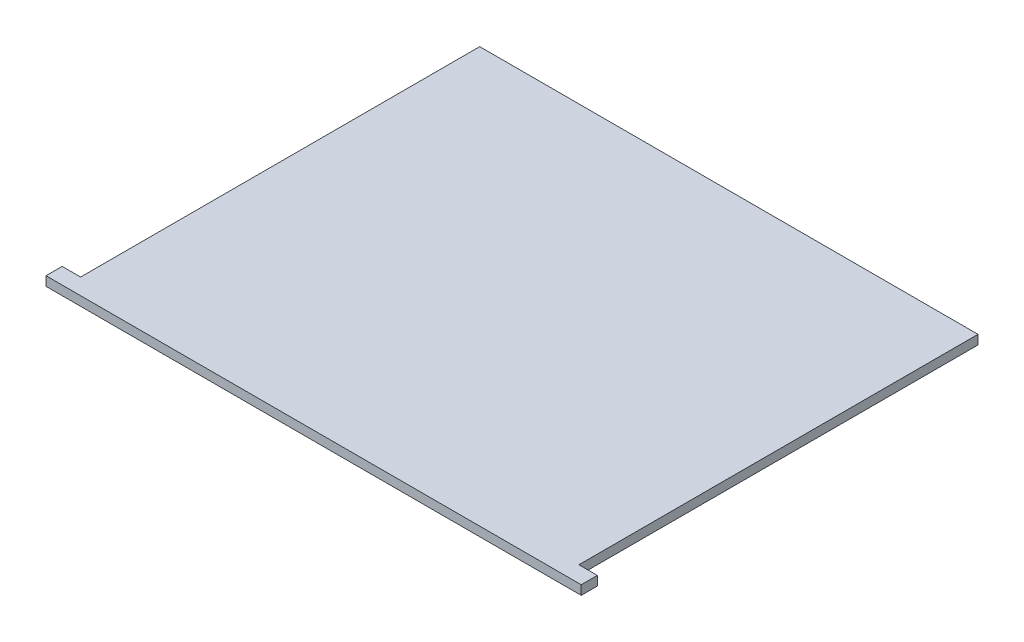
ISO-10303-21;
HEADER;
FILE_DESCRIPTION(('STEP AP214'),'2;1');
FILE_NAME('part.step','',(''),(''),'','','');
FILE_SCHEMA(('AUTOMOTIVE_DESIGN { 1 0 10303 214 1 1 1 1 }'));
ENDSEC;
DATA;
#1=APPLICATION_CONTEXT('core data for automotive mechanical design processes');
#2=APPLICATION_PROTOCOL_DEFINITION('international standard','automotive_design',2000,#1);
#3=PRODUCT_CONTEXT('',#1,'mechanical');
#4=PRODUCT('Part','Part','',(#3));
#5=PRODUCT_RELATED_PRODUCT_CATEGORY('part','',(#4));
#6=PRODUCT_DEFINITION_FORMATION('','',#4);
#7=PRODUCT_DEFINITION_CONTEXT('part definition',#1,'design');
#8=PRODUCT_DEFINITION('design','',#6,#7);
#9=PRODUCT_DEFINITION_SHAPE('','',#8);
#10=(LENGTH_UNIT() NAMED_UNIT(*) SI_UNIT(.MILLI.,.METRE.));
#11=(NAMED_UNIT(*) PLANE_ANGLE_UNIT() SI_UNIT($,.RADIAN.));
#12=(NAMED_UNIT(*) SI_UNIT($,.STERADIAN.) SOLID_ANGLE_UNIT());
#13=UNCERTAINTY_MEASURE_WITH_UNIT(LENGTH_MEASURE(1.E-05),#10,'distance_accuracy_value','');
#14=(GEOMETRIC_REPRESENTATION_CONTEXT(3) GLOBAL_UNCERTAINTY_ASSIGNED_CONTEXT((#13)) GLOBAL_UNIT_ASSIGNED_CONTEXT((#10,
#11,#12)) REPRESENTATION_CONTEXT('',''));
#15=CARTESIAN_POINT('',(0.,0.,0.));
#16=DIRECTION('',(0.,0.,1.));
#17=DIRECTION('',(1.,0.,0.));
#18=AXIS2_PLACEMENT_3D('',#15,#16,#17);
#19=CARTESIAN_POINT('',(27.,1.,-22.5));
#20=DIRECTION('',(-1.,0.,0.));
#21=DIRECTION('',(0.,0.,1.));
#22=AXIS2_PLACEMENT_3D('',#19,#20,#21);
#23=PLANE('',#22);
#24=DIRECTION('',(0.,0.,-1.));
#25=VECTOR('',#24,1.);
#26=CARTESIAN_POINT('',(27.,0.,-22.5));
#27=LINE('',#26,#25);
#28=CARTESIAN_POINT('',(27.,0.,20.75));
#29=VERTEX_POINT('',#28);
#30=CARTESIAN_POINT('',(27.,0.,-22.5));
#31=VERTEX_POINT('',#30);
#32=EDGE_CURVE('E127',#29,#31,#27,.T.);
#33=ORIENTED_EDGE('',*,*,#32,.T.);
#34=DIRECTION('',(0.,-1.,0.));
#35=VECTOR('',#34,1.);
#36=CARTESIAN_POINT('',(27.,1.,-22.5));
#37=LINE('',#36,#35);
#38=CARTESIAN_POINT('',(27.,1.,-22.5));
#39=VERTEX_POINT('',#38);
#40=EDGE_CURVE('E11',#39,#31,#37,.T.);
#41=ORIENTED_EDGE('',*,*,#40,.F.);
#42=DIRECTION('',(0.,0.,-1.));
#43=VECTOR('',#42,1.);
#44=CARTESIAN_POINT('',(27.,1.,-22.5));
#45=LINE('',#44,#43);
#46=CARTESIAN_POINT('',(27.,1.,20.75));
#47=VERTEX_POINT('',#46);
#48=EDGE_CURVE('E142',#47,#39,#45,.T.);
#49=ORIENTED_EDGE('',*,*,#48,.F.);
#50=DIRECTION('',(0.,-1.,0.));
#51=VECTOR('',#50,1.);
#52=CARTESIAN_POINT('',(27.,1.,20.75));
#53=LINE('',#52,#51);
#54=EDGE_CURVE('E123',#47,#29,#53,.T.);
#55=ORIENTED_EDGE('',*,*,#54,.T.);
#56=EDGE_LOOP('',(#33,#41,#49,#55));
#57=FACE_BOUND('',#56,.T.);
#58=ADVANCED_FACE('F32',(#57),#23,.F.);
#59=CARTESIAN_POINT('',(-27.,1.,-22.5));
#60=DIRECTION('',(0.,0.,1.));
#61=DIRECTION('',(1.,0.,0.));
#62=AXIS2_PLACEMENT_3D('',#59,#60,#61);
#63=PLANE('',#62);
#64=DIRECTION('',(-1.,0.,0.));
#65=VECTOR('',#64,1.);
#66=CARTESIAN_POINT('',(-27.,0.,-22.5));
#67=LINE('',#66,#65);
#68=CARTESIAN_POINT('',(-27.,0.,-22.5));
#69=VERTEX_POINT('',#68);
#70=EDGE_CURVE('E130',#31,#69,#67,.T.);
#71=ORIENTED_EDGE('',*,*,#70,.T.);
#72=DIRECTION('',(0.,-1.,0.));
#73=VECTOR('',#72,1.);
#74=CARTESIAN_POINT('',(-27.,1.,-22.5));
#75=LINE('',#74,#73);
#76=CARTESIAN_POINT('',(-27.,1.,-22.5));
#77=VERTEX_POINT('',#76);
#78=EDGE_CURVE('E40',#77,#69,#75,.T.);
#79=ORIENTED_EDGE('',*,*,#78,.F.);
#80=DIRECTION('',(-1.,0.,0.));
#81=VECTOR('',#80,1.);
#82=CARTESIAN_POINT('',(-27.,1.,-22.5));
#83=LINE('',#82,#81);
#84=EDGE_CURVE('E91',#39,#77,#83,.T.);
#85=ORIENTED_EDGE('',*,*,#84,.F.);
#86=ORIENTED_EDGE('',*,*,#40,.T.);
#87=EDGE_LOOP('',(#71,#79,#85,#86));
#88=FACE_BOUND('',#87,.T.);
#89=ADVANCED_FACE('F177',(#88),#63,.F.);
#90=CARTESIAN_POINT('',(-27.,1.,-22.5));
#91=DIRECTION('',(1.,0.,0.));
#92=DIRECTION('',(0.,0.,-1.));
#93=AXIS2_PLACEMENT_3D('',#90,#91,#92);
#94=PLANE('',#93);
#95=DIRECTION('',(0.,0.,1.));
#96=VECTOR('',#95,1.);
#97=CARTESIAN_POINT('',(-27.,0.,-22.5));
#98=LINE('',#97,#96);
#99=CARTESIAN_POINT('',(-27.,0.,20.75));
#100=VERTEX_POINT('',#99);
#101=EDGE_CURVE('E132',#69,#100,#98,.T.);
#102=ORIENTED_EDGE('',*,*,#101,.T.);
#103=DIRECTION('',(0.,-1.,0.));
#104=VECTOR('',#103,1.);
#105=CARTESIAN_POINT('',(-27.,1.,20.75));
#106=LINE('',#105,#104);
#107=CARTESIAN_POINT('',(-27.,1.,20.75));
#108=VERTEX_POINT('',#107);
#109=EDGE_CURVE('E149',#108,#100,#106,.T.);
#110=ORIENTED_EDGE('',*,*,#109,.F.);
#111=DIRECTION('',(0.,0.,1.));
#112=VECTOR('',#111,1.);
#113=CARTESIAN_POINT('',(-27.,1.,-22.5));
#114=LINE('',#113,#112);
#115=EDGE_CURVE('E157',#77,#108,#114,.T.);
#116=ORIENTED_EDGE('',*,*,#115,.F.);
#117=ORIENTED_EDGE('',*,*,#78,.T.);
#118=EDGE_LOOP('',(#102,#110,#116,#117));
#119=FACE_BOUND('',#118,.T.);
#120=ADVANCED_FACE('F155',(#119),#94,.F.);
#121=CARTESIAN_POINT('',(-27.,1.,20.75));
#122=DIRECTION('',(0.,0.,1.));
#123=DIRECTION('',(1.,0.,0.));
#124=AXIS2_PLACEMENT_3D('',#121,#122,#123);
#125=PLANE('',#124);
#126=DIRECTION('',(-1.,0.,0.));
#127=VECTOR('',#126,1.);
#128=CARTESIAN_POINT('',(-27.,0.,20.75));
#129=LINE('',#128,#127);
#130=CARTESIAN_POINT('',(-29.,0.,20.75));
#131=VERTEX_POINT('',#130);
#132=EDGE_CURVE('E134',#100,#131,#129,.T.);
#133=ORIENTED_EDGE('',*,*,#132,.T.);
#134=DIRECTION('',(0.,-1.,0.));
#135=VECTOR('',#134,1.);
#136=CARTESIAN_POINT('',(-29.,1.,20.75));
#137=LINE('',#136,#135);
#138=CARTESIAN_POINT('',(-29.,1.,20.75));
#139=VERTEX_POINT('',#138);
#140=EDGE_CURVE('E146',#139,#131,#137,.T.);
#141=ORIENTED_EDGE('',*,*,#140,.F.);
#142=DIRECTION('',(-1.,0.,0.));
#143=VECTOR('',#142,1.);
#144=CARTESIAN_POINT('',(-27.,1.,20.75));
#145=LINE('',#144,#143);
#146=EDGE_CURVE('E169',#108,#139,#145,.T.);
#147=ORIENTED_EDGE('',*,*,#146,.F.);
#148=ORIENTED_EDGE('',*,*,#109,.T.);
#149=EDGE_LOOP('',(#133,#141,#147,#148));
#150=FACE_BOUND('',#149,.T.);
#151=ADVANCED_FACE('F165',(#150),#125,.F.);
#152=CARTESIAN_POINT('',(-29.,1.,20.75));
#153=DIRECTION('',(1.,0.,0.));
#154=DIRECTION('',(0.,0.,-1.));
#155=AXIS2_PLACEMENT_3D('',#152,#153,#154);
#156=PLANE('',#155);
#157=DIRECTION('',(0.,0.,1.));
#158=VECTOR('',#157,1.);
#159=CARTESIAN_POINT('',(-29.,0.,20.75));
#160=LINE('',#159,#158);
#161=CARTESIAN_POINT('',(-29.,0.,22.5));
#162=VERTEX_POINT('',#161);
#163=EDGE_CURVE('E136',#131,#162,#160,.T.);
#164=ORIENTED_EDGE('',*,*,#163,.T.);
#165=DIRECTION('',(0.,-1.,0.));
#166=VECTOR('',#165,1.);
#167=CARTESIAN_POINT('',(-29.,1.,22.5));
#168=LINE('',#167,#166);
#169=CARTESIAN_POINT('',(-29.,1.,22.5));
#170=VERTEX_POINT('',#169);
#171=EDGE_CURVE('E118',#170,#162,#168,.T.);
#172=ORIENTED_EDGE('',*,*,#171,.F.);
#173=DIRECTION('',(0.,0.,1.));
#174=VECTOR('',#173,1.);
#175=CARTESIAN_POINT('',(-29.,1.,20.75));
#176=LINE('',#175,#174);
#177=EDGE_CURVE('E110',#139,#170,#176,.T.);
#178=ORIENTED_EDGE('',*,*,#177,.F.);
#179=ORIENTED_EDGE('',*,*,#140,.T.);
#180=EDGE_LOOP('',(#164,#172,#178,#179));
#181=FACE_BOUND('',#180,.T.);
#182=ADVANCED_FACE('F168',(#181),#156,.F.);
#183=CARTESIAN_POINT('',(29.,1.,22.5));
#184=DIRECTION('',(0.,0.,-1.));
#185=DIRECTION('',(-1.,0.,0.));
#186=AXIS2_PLACEMENT_3D('',#183,#184,#185);
#187=PLANE('',#186);
#188=DIRECTION('',(1.,0.,0.));
#189=VECTOR('',#188,1.);
#190=CARTESIAN_POINT('',(29.,0.,22.5));
#191=LINE('',#190,#189);
#192=CARTESIAN_POINT('',(29.,0.,22.5));
#193=VERTEX_POINT('',#192);
#194=EDGE_CURVE('E117',#162,#193,#191,.T.);
#195=ORIENTED_EDGE('',*,*,#194,.T.);
#196=DIRECTION('',(0.,-1.,0.));
#197=VECTOR('',#196,1.);
#198=CARTESIAN_POINT('',(29.,1.,22.5));
#199=LINE('',#198,#197);
#200=CARTESIAN_POINT('',(29.,1.,22.5));
#201=VERTEX_POINT('',#200);
#202=EDGE_CURVE('E115',#201,#193,#199,.T.);
#203=ORIENTED_EDGE('',*,*,#202,.F.);
#204=DIRECTION('',(1.,0.,0.));
#205=VECTOR('',#204,1.);
#206=CARTESIAN_POINT('',(-29.,1.,22.5));
#207=LINE('',#206,#205);
#208=EDGE_CURVE('E104',#170,#201,#207,.T.);
#209=ORIENTED_EDGE('',*,*,#208,.F.);
#210=ORIENTED_EDGE('',*,*,#171,.T.);
#211=EDGE_LOOP('',(#195,#203,#209,#210));
#212=FACE_BOUND('',#211,.T.);
#213=ADVANCED_FACE('F116',(#212),#187,.F.);
#214=CARTESIAN_POINT('',(29.,1.,20.75));
#215=DIRECTION('',(-1.,0.,0.));
#216=DIRECTION('',(0.,0.,1.));
#217=AXIS2_PLACEMENT_3D('',#214,#215,#216);
#218=PLANE('',#217);
#219=DIRECTION('',(0.,0.,-1.));
#220=VECTOR('',#219,1.);
#221=CARTESIAN_POINT('',(29.,0.,20.75));
#222=LINE('',#221,#220);
#223=CARTESIAN_POINT('',(29.,0.,20.75));
#224=VERTEX_POINT('',#223);
#225=EDGE_CURVE('E77',#193,#224,#222,.T.);
#226=ORIENTED_EDGE('',*,*,#225,.T.);
#227=DIRECTION('',(0.,-1.,0.));
#228=VECTOR('',#227,1.);
#229=CARTESIAN_POINT('',(29.,1.,20.75));
#230=LINE('',#229,#228);
#231=CARTESIAN_POINT('',(29.,1.,20.75));
#232=VERTEX_POINT('',#231);
#233=EDGE_CURVE('E119',#232,#224,#230,.T.);
#234=ORIENTED_EDGE('',*,*,#233,.F.);
#235=DIRECTION('',(0.,0.,-1.));
#236=VECTOR('',#235,1.);
#237=CARTESIAN_POINT('',(29.,1.,20.75));
#238=LINE('',#237,#236);
#239=EDGE_CURVE('E108',#201,#232,#238,.T.);
#240=ORIENTED_EDGE('',*,*,#239,.F.);
#241=ORIENTED_EDGE('',*,*,#202,.T.);
#242=EDGE_LOOP('',(#226,#234,#240,#241));
#243=FACE_BOUND('',#242,.T.);
#244=ADVANCED_FACE('F121',(#243),#218,.F.);
#245=CARTESIAN_POINT('',(27.,1.,20.75));
#246=DIRECTION('',(0.,0.,1.));
#247=DIRECTION('',(1.,0.,0.));
#248=AXIS2_PLACEMENT_3D('',#245,#246,#247);
#249=PLANE('',#248);
#250=DIRECTION('',(-1.,0.,0.));
#251=VECTOR('',#250,1.);
#252=CARTESIAN_POINT('',(27.,0.,20.75));
#253=LINE('',#252,#251);
#254=EDGE_CURVE('E83',#224,#29,#253,.T.);
#255=ORIENTED_EDGE('',*,*,#254,.T.);
#256=ORIENTED_EDGE('',*,*,#54,.F.);
#257=DIRECTION('',(-1.,0.,0.));
#258=VECTOR('',#257,1.);
#259=CARTESIAN_POINT('',(27.,1.,20.75));
#260=LINE('',#259,#258);
#261=EDGE_CURVE('E48',#232,#47,#260,.T.);
#262=ORIENTED_EDGE('',*,*,#261,.F.);
#263=ORIENTED_EDGE('',*,*,#233,.T.);
#264=EDGE_LOOP('',(#255,#256,#262,#263));
#265=FACE_BOUND('',#264,.T.);
#266=ADVANCED_FACE('F193',(#265),#249,.F.);
#267=CARTESIAN_POINT('',(0.,1.,0.));
#268=DIRECTION('',(0.,1.,0.));
#269=DIRECTION('',(0.,0.,1.));
#270=AXIS2_PLACEMENT_3D('',#267,#268,#269);
#271=PLANE('',#270);
#272=ORIENTED_EDGE('',*,*,#48,.T.);
#273=ORIENTED_EDGE('',*,*,#84,.T.);
#274=ORIENTED_EDGE('',*,*,#115,.T.);
#275=ORIENTED_EDGE('',*,*,#146,.T.);
#276=ORIENTED_EDGE('',*,*,#177,.T.);
#277=ORIENTED_EDGE('',*,*,#208,.T.);
#278=ORIENTED_EDGE('',*,*,#239,.T.);
#279=ORIENTED_EDGE('',*,*,#261,.T.);
#280=EDGE_LOOP('',(#272,#273,#274,#275,#276,#277,#278,#279));
#281=FACE_BOUND('',#280,.T.);
#282=ADVANCED_FACE('F106',(#281),#271,.T.);
#283=CARTESIAN_POINT('',(0.,0.,0.));
#284=DIRECTION('',(0.,1.,0.));
#285=DIRECTION('',(0.,0.,1.));
#286=AXIS2_PLACEMENT_3D('',#283,#284,#285);
#287=PLANE('',#286);
#288=ORIENTED_EDGE('',*,*,#32,.F.);
#289=ORIENTED_EDGE('',*,*,#254,.F.);
#290=ORIENTED_EDGE('',*,*,#225,.F.);
#291=ORIENTED_EDGE('',*,*,#194,.F.);
#292=ORIENTED_EDGE('',*,*,#163,.F.);
#293=ORIENTED_EDGE('',*,*,#132,.F.);
#294=ORIENTED_EDGE('',*,*,#101,.F.);
#295=ORIENTED_EDGE('',*,*,#70,.F.);
#296=EDGE_LOOP('',(#288,#289,#290,#291,#292,#293,#294,#295));
#297=FACE_BOUND('',#296,.T.);
#298=ADVANCED_FACE('F161',(#297),#287,.F.);
#299=CLOSED_SHELL('',(#58,#89,#120,#151,#182,#213,#244,#266,#282,#298));
#300=MANIFOLD_SOLID_BREP('B2',#299);
#301=ADVANCED_BREP_SHAPE_REPRESENTATION('',(#18,#300),#14);
#302=SHAPE_DEFINITION_REPRESENTATION(#9,#301);
ENDSEC;
END-ISO-10303-21;
